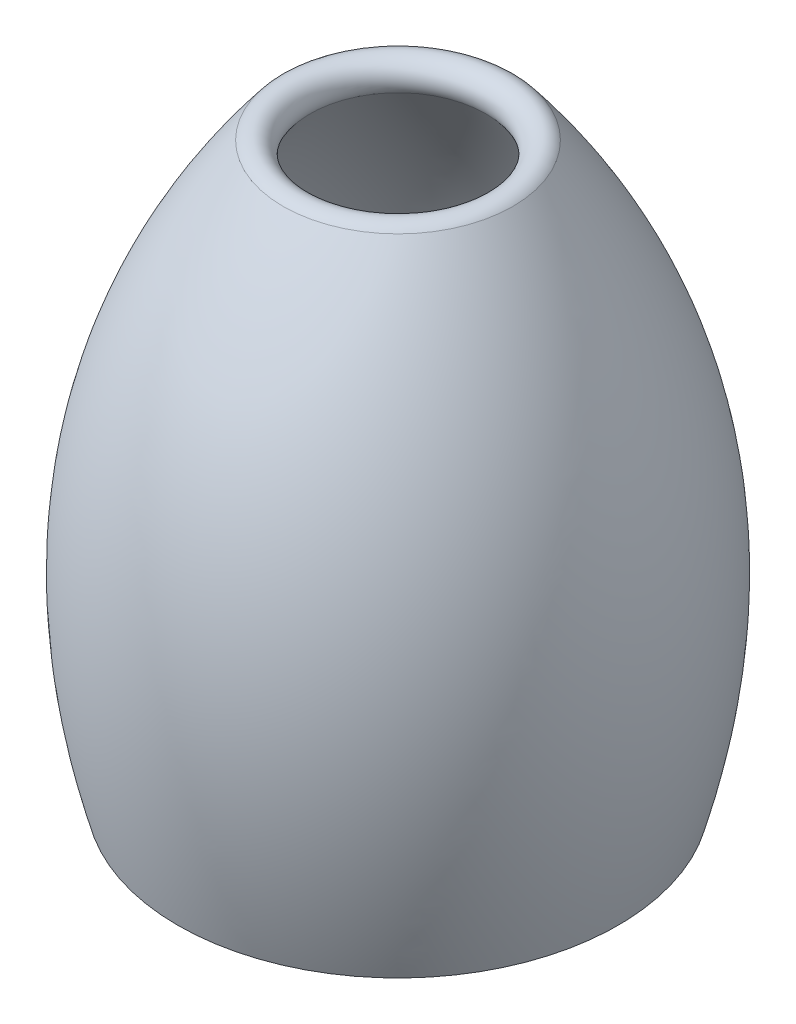
ISO-10303-21;
HEADER;
FILE_DESCRIPTION(('STEP AP214'),'2;1');
FILE_NAME('part.step','',(''),(''),'','','');
FILE_SCHEMA(('AUTOMOTIVE_DESIGN { 1 0 10303 214 1 1 1 1 }'));
ENDSEC;
DATA;
#1=APPLICATION_CONTEXT('core data for automotive mechanical design processes');
#2=APPLICATION_PROTOCOL_DEFINITION('international standard','automotive_design',2000,#1);
#3=PRODUCT_CONTEXT('',#1,'mechanical');
#4=PRODUCT('Part','Part','',(#3));
#5=PRODUCT_RELATED_PRODUCT_CATEGORY('part','',(#4));
#6=PRODUCT_DEFINITION_FORMATION('','',#4);
#7=PRODUCT_DEFINITION_CONTEXT('part definition',#1,'design');
#8=PRODUCT_DEFINITION('design','',#6,#7);
#9=PRODUCT_DEFINITION_SHAPE('','',#8);
#10=(LENGTH_UNIT() NAMED_UNIT(*) SI_UNIT(.MILLI.,.METRE.));
#11=(NAMED_UNIT(*) PLANE_ANGLE_UNIT() SI_UNIT($,.RADIAN.));
#12=(NAMED_UNIT(*) SI_UNIT($,.STERADIAN.) SOLID_ANGLE_UNIT());
#13=UNCERTAINTY_MEASURE_WITH_UNIT(LENGTH_MEASURE(1.E-05),#10,'distance_accuracy_value','');
#14=(GEOMETRIC_REPRESENTATION_CONTEXT(3) GLOBAL_UNCERTAINTY_ASSIGNED_CONTEXT((#13)) GLOBAL_UNIT_ASSIGNED_CONTEXT((#10,
#11,#12)) REPRESENTATION_CONTEXT('',''));
#15=CARTESIAN_POINT('',(0.,0.,0.));
#16=DIRECTION('',(0.,0.,1.));
#17=DIRECTION('',(1.,0.,0.));
#18=AXIS2_PLACEMENT_3D('',#15,#16,#17);
#19=CARTESIAN_POINT('',(15.392012511488,83.3203983059887,0.));
#20=CARTESIAN_POINT('',(-13.1800767746206,46.9799664372495,0.));
#21=CARTESIAN_POINT('',(0.,0.,0.));
#22=B_SPLINE_CURVE_WITH_KNOTS('',2,(#19,#20,#21),.UNSPECIFIED.,.F.,.F.,(3,3),(0.,1.),.UNSPECIFIED.);
#23=CARTESIAN_POINT('',(32.1832988876567,1.3505902148963,0.));
#24=DIRECTION('',(0.,-1.,0.));
#25=AXIS1_PLACEMENT('',#23,#24);
#26=SURFACE_OF_REVOLUTION('',#22,#25);
#27=CARTESIAN_POINT('',(32.1832988876567,0.,0.));
#28=DIRECTION('',(0.,-1.,0.));
#29=DIRECTION('',(0.,0.,-1.));
#30=AXIS2_PLACEMENT_3D('',#27,#28,#29);
#31=CIRCLE('',#30,32.1832988876567);
#32=CARTESIAN_POINT('',(32.1832988876567,0.,-32.1832988876567));
#33=VERTEX_POINT('',#32);
#34=EDGE_CURVE('E10',#33,#33,#31,.T.);
#35=ORIENTED_EDGE('',*,*,#34,.F.);
#36=EDGE_LOOP('',(#35));
#37=FACE_BOUND('',#36,.T.);
#38=CARTESIAN_POINT('',(32.1832988876567,83.3203983059887,0.));
#39=DIRECTION('',(0.,-1.,0.));
#40=DIRECTION('',(0.,0.,-1.));
#41=AXIS2_PLACEMENT_3D('',#38,#39,#40);
#42=CIRCLE('',#41,16.7912863761687);
#43=CARTESIAN_POINT('',(32.1832988876567,83.3203983059887,-16.7912863761687));
#44=VERTEX_POINT('',#43);
#45=EDGE_CURVE('E61',#44,#44,#42,.T.);
#46=ORIENTED_EDGE('',*,*,#45,.T.);
#47=EDGE_LOOP('',(#46));
#48=FACE_BOUND('',#47,.T.);
#49=ADVANCED_FACE('F43',(#37,#48),#26,.T.);
#50=CARTESIAN_POINT('',(32.1832988876567,0.,0.));
#51=DIRECTION('',(0.,-1.,0.));
#52=DIRECTION('',(0.,0.,-1.));
#53=AXIS2_PLACEMENT_3D('',#50,#51,#52);
#54=CONICAL_SURFACE('',#53,32.1832988876567,1.29728069705856);
#55=CARTESIAN_POINT('',(32.1832988876567,1.3505902148963,0.));
#56=DIRECTION('',(0.,-1.,0.));
#57=DIRECTION('',(0.,0.,-1.));
#58=AXIS2_PLACEMENT_3D('',#55,#56,#57);
#59=CIRCLE('',#58,27.3691628206737);
#60=CARTESIAN_POINT('',(32.1832988876567,1.3505902148963,-27.3691628206737));
#61=VERTEX_POINT('',#60);
#62=EDGE_CURVE('E51',#61,#61,#59,.T.);
#63=ORIENTED_EDGE('',*,*,#62,.F.);
#64=EDGE_LOOP('',(#63));
#65=FACE_BOUND('',#64,.T.);
#66=ORIENTED_EDGE('',*,*,#34,.T.);
#67=EDGE_LOOP('',(#66));
#68=FACE_BOUND('',#67,.T.);
#69=ADVANCED_FACE('F81',(#65,#68),#54,.F.);
#70=CARTESIAN_POINT('',(4.81413606698298,1.3505902148963,0.));
#71=CARTESIAN_POINT('',(0.0928206819503778,18.2626308627026,0.));
#72=CARTESIAN_POINT('',(1.56476577145557,43.5760731389392,0.));
#73=CARTESIAN_POINT('',(9.13677836713357,67.246654090547,0.));
#74=CARTESIAN_POINT('',(19.3226112824637,80.2300272438661,0.));
#75=B_SPLINE_CURVE_WITH_KNOTS('',2,(#70,#71,#72,#73,#74),.UNSPECIFIED.,.F.,.F.,(3,1,1,3),(0.,
0.375,0.625,1.),.UNSPECIFIED.);
#76=CARTESIAN_POINT('',(32.1832988876567,1.3505902148963,0.));
#77=DIRECTION('',(0.,-1.,0.));
#78=AXIS1_PLACEMENT('',#76,#77);
#79=SURFACE_OF_REVOLUTION('',#75,#78);
#80=CARTESIAN_POINT('',(32.1832988876567,80.2300272438661,0.));
#81=DIRECTION('',(0.,-1.,0.));
#82=DIRECTION('',(0.,0.,-1.));
#83=AXIS2_PLACEMENT_3D('',#80,#81,#82);
#84=CIRCLE('',#83,12.860687605193);
#85=CARTESIAN_POINT('',(32.1832988876567,80.2300272438661,-12.860687605193));
#86=VERTEX_POINT('',#85);
#87=EDGE_CURVE('E56',#86,#86,#84,.T.);
#88=ORIENTED_EDGE('',*,*,#87,.F.);
#89=EDGE_LOOP('',(#88));
#90=FACE_BOUND('',#89,.T.);
#91=ORIENTED_EDGE('',*,*,#62,.T.);
#92=EDGE_LOOP('',(#91));
#93=FACE_BOUND('',#92,.T.);
#94=ADVANCED_FACE('F77',(#90,#93),#79,.T.);
#95=CARTESIAN_POINT('',(32.1832988876567,81.5406702137654,0.));
#96=DIRECTION('',(0.,-1.,0.));
#97=DIRECTION('',(0.,0.,-1.));
#98=AXIS2_PLACEMENT_3D('',#95,#96,#97);
#99=TOROIDAL_SURFACE('',#98,15.010392366575,2.51774016841594);
#100=ORIENTED_EDGE('',*,*,#45,.F.);
#101=EDGE_LOOP('',(#100));
#102=FACE_BOUND('',#101,.T.);
#103=ORIENTED_EDGE('',*,*,#87,.T.);
#104=EDGE_LOOP('',(#103));
#105=FACE_BOUND('',#104,.T.);
#106=ADVANCED_FACE('F80',(#102,#105),#99,.T.);
#107=CLOSED_SHELL('',(#49,#69,#94,#106));
#108=MANIFOLD_SOLID_BREP('B2',#107);
#109=ADVANCED_BREP_SHAPE_REPRESENTATION('',(#18,#108),#14);
#110=SHAPE_DEFINITION_REPRESENTATION(#9,#109);
ENDSEC;
END-ISO-10303-21;
